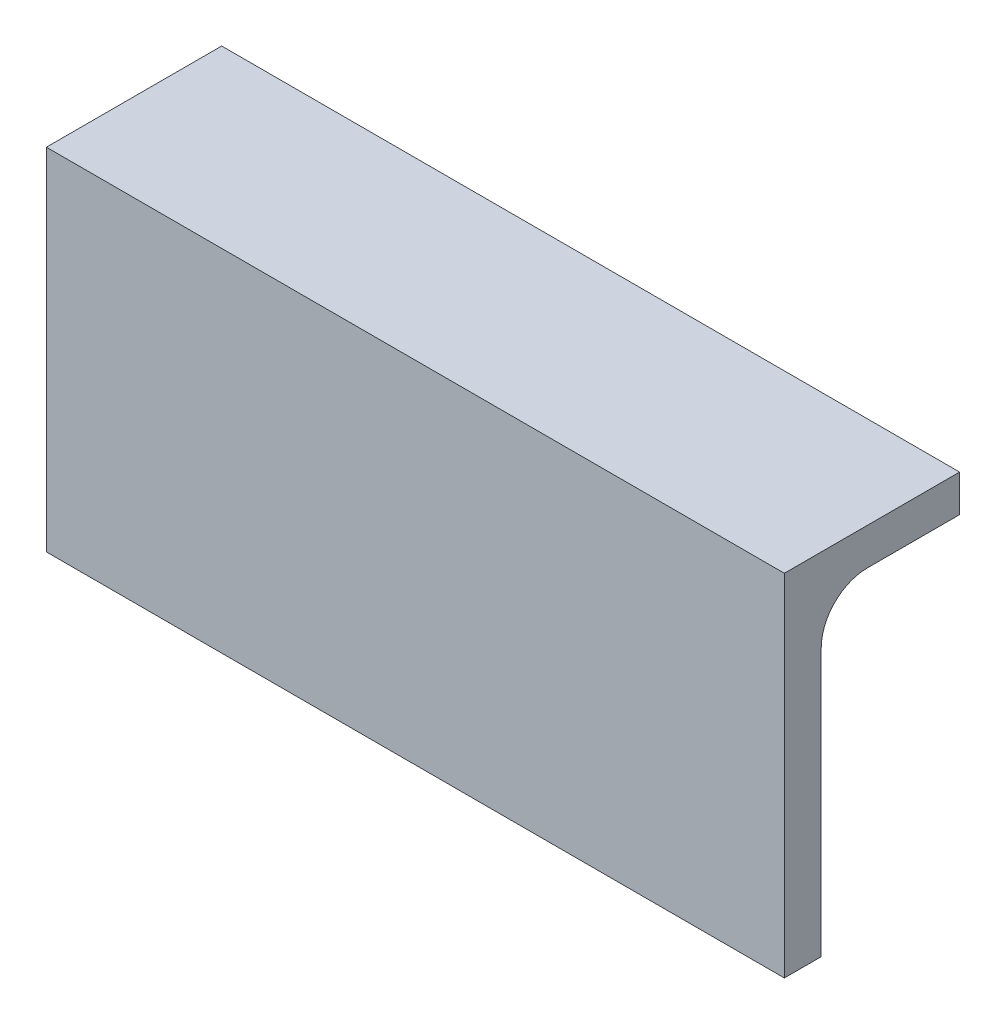
ISO-10303-21;
HEADER;
FILE_DESCRIPTION(('STEP AP214'),'2;1');
FILE_NAME('part.step','',(''),(''),'','','');
FILE_SCHEMA(('AUTOMOTIVE_DESIGN { 1 0 10303 214 1 1 1 1 }'));
ENDSEC;
DATA;
#1=APPLICATION_CONTEXT('core data for automotive mechanical design processes');
#2=APPLICATION_PROTOCOL_DEFINITION('international standard','automotive_design',2000,#1);
#3=PRODUCT_CONTEXT('',#1,'mechanical');
#4=PRODUCT('Part','Part','',(#3));
#5=PRODUCT_RELATED_PRODUCT_CATEGORY('part','',(#4));
#6=PRODUCT_DEFINITION_FORMATION('','',#4);
#7=PRODUCT_DEFINITION_CONTEXT('part definition',#1,'design');
#8=PRODUCT_DEFINITION('design','',#6,#7);
#9=PRODUCT_DEFINITION_SHAPE('','',#8);
#10=(LENGTH_UNIT() NAMED_UNIT(*) SI_UNIT(.MILLI.,.METRE.));
#11=(NAMED_UNIT(*) PLANE_ANGLE_UNIT() SI_UNIT($,.RADIAN.));
#12=(NAMED_UNIT(*) SI_UNIT($,.STERADIAN.) SOLID_ANGLE_UNIT());
#13=UNCERTAINTY_MEASURE_WITH_UNIT(LENGTH_MEASURE(1.E-05),#10,'distance_accuracy_value','');
#14=(GEOMETRIC_REPRESENTATION_CONTEXT(3) GLOBAL_UNCERTAINTY_ASSIGNED_CONTEXT((#13)) GLOBAL_UNIT_ASSIGNED_CONTEXT((#10,
#11,#12)) REPRESENTATION_CONTEXT('',''));
#15=CARTESIAN_POINT('',(0.,0.,0.));
#16=DIRECTION('',(0.,0.,1.));
#17=DIRECTION('',(1.,0.,0.));
#18=AXIS2_PLACEMENT_3D('',#15,#16,#17);
#19=CARTESIAN_POINT('',(0.,0.,1.6));
#20=DIRECTION('',(1.,0.,0.));
#21=DIRECTION('',(0.,1.,0.));
#22=AXIS2_PLACEMENT_3D('',#19,#20,#21);
#23=PLANE('',#22);
#24=DIRECTION('',(0.,0.,1.));
#25=VECTOR('',#24,1.);
#26=CARTESIAN_POINT('',(0.,-0.8,1.6));
#27=LINE('',#26,#25);
#28=CARTESIAN_POINT('',(0.,-0.8,-6.));
#29=VERTEX_POINT('',#28);
#30=CARTESIAN_POINT('',(0.,-0.8,1.6));
#31=VERTEX_POINT('',#30);
#32=EDGE_CURVE('E96',#29,#31,#27,.T.);
#33=ORIENTED_EDGE('',*,*,#32,.F.);
#34=DIRECTION('',(0.,1.,0.));
#35=VECTOR('',#34,1.);
#36=CARTESIAN_POINT('',(0.,0.,-6.));
#37=LINE('',#36,#35);
#38=CARTESIAN_POINT('',(0.,-2.4,-6.));
#39=VERTEX_POINT('',#38);
#40=EDGE_CURVE('E146',#39,#29,#37,.T.);
#41=ORIENTED_EDGE('',*,*,#40,.F.);
#42=DIRECTION('',(0.,0.,1.));
#43=VECTOR('',#42,1.);
#44=CARTESIAN_POINT('',(0.,-2.4,-6.));
#45=LINE('',#44,#43);
#46=CARTESIAN_POINT('',(0.,-2.4,-2.));
#47=VERTEX_POINT('',#46);
#48=EDGE_CURVE('E141',#39,#47,#45,.T.);
#49=ORIENTED_EDGE('',*,*,#48,.T.);
#50=CARTESIAN_POINT('',(0.,-4.4,-2.));
#51=DIRECTION('',(1.,0.,0.));
#52=DIRECTION('',(0.,1.,0.));
#53=AXIS2_PLACEMENT_3D('',#50,#51,#52);
#54=CIRCLE('',#53,2.);
#55=CARTESIAN_POINT('',(0.,-4.4,0.));
#56=VERTEX_POINT('',#55);
#57=EDGE_CURVE('E41',#47,#56,#54,.T.);
#58=ORIENTED_EDGE('',*,*,#57,.T.);
#59=DIRECTION('',(0.,-1.,0.));
#60=VECTOR('',#59,1.);
#61=CARTESIAN_POINT('',(0.,0.,0.));
#62=LINE('',#61,#60);
#63=CARTESIAN_POINT('',(0.,-16.,0.));
#64=VERTEX_POINT('',#63);
#65=EDGE_CURVE('E123',#56,#64,#62,.T.);
#66=ORIENTED_EDGE('',*,*,#65,.T.);
#67=DIRECTION('',(0.,0.,-1.));
#68=VECTOR('',#67,1.);
#69=CARTESIAN_POINT('',(0.,-16.,1.6));
#70=LINE('',#69,#68);
#71=CARTESIAN_POINT('',(0.,-16.,1.6));
#72=VERTEX_POINT('',#71);
#73=EDGE_CURVE('E117',#72,#64,#70,.T.);
#74=ORIENTED_EDGE('',*,*,#73,.F.);
#75=DIRECTION('',(0.,-1.,0.));
#76=VECTOR('',#75,1.);
#77=CARTESIAN_POINT('',(0.,0.,1.6));
#78=LINE('',#77,#76);
#79=EDGE_CURVE('E119',#31,#72,#78,.T.);
#80=ORIENTED_EDGE('',*,*,#79,.F.);
#81=EDGE_LOOP('',(#33,#41,#49,#58,#66,#74,#80));
#82=FACE_BOUND('',#81,.T.);
#83=ADVANCED_FACE('F33',(#82),#23,.F.);
#84=CARTESIAN_POINT('',(32.,0.,1.6));
#85=DIRECTION('',(-1.,0.,0.));
#86=DIRECTION('',(0.,0.,1.));
#87=AXIS2_PLACEMENT_3D('',#84,#85,#86);
#88=PLANE('',#87);
#89=DIRECTION('',(0.,0.,-1.));
#90=VECTOR('',#89,1.);
#91=CARTESIAN_POINT('',(32.,-0.8,1.6));
#92=LINE('',#91,#90);
#93=CARTESIAN_POINT('',(32.,-0.8,1.6));
#94=VERTEX_POINT('',#93);
#95=CARTESIAN_POINT('',(32.,-0.8,-6.));
#96=VERTEX_POINT('',#95);
#97=EDGE_CURVE('E93',#94,#96,#92,.T.);
#98=ORIENTED_EDGE('',*,*,#97,.F.);
#99=DIRECTION('',(0.,1.,0.));
#100=VECTOR('',#99,1.);
#101=CARTESIAN_POINT('',(32.,0.,1.6));
#102=LINE('',#101,#100);
#103=CARTESIAN_POINT('',(32.,-16.,1.6));
#104=VERTEX_POINT('',#103);
#105=EDGE_CURVE('E107',#104,#94,#102,.T.);
#106=ORIENTED_EDGE('',*,*,#105,.F.);
#107=DIRECTION('',(0.,0.,-1.));
#108=VECTOR('',#107,1.);
#109=CARTESIAN_POINT('',(32.,-16.,1.6));
#110=LINE('',#109,#108);
#111=CARTESIAN_POINT('',(32.,-16.,0.));
#112=VERTEX_POINT('',#111);
#113=EDGE_CURVE('E115',#104,#112,#110,.T.);
#114=ORIENTED_EDGE('',*,*,#113,.T.);
#115=DIRECTION('',(0.,1.,0.));
#116=VECTOR('',#115,1.);
#117=CARTESIAN_POINT('',(32.,0.,0.));
#118=LINE('',#117,#116);
#119=CARTESIAN_POINT('',(32.,-4.4,0.));
#120=VERTEX_POINT('',#119);
#121=EDGE_CURVE('E128',#112,#120,#118,.T.);
#122=ORIENTED_EDGE('',*,*,#121,.T.);
#123=CARTESIAN_POINT('',(32.,-4.4,-2.));
#124=DIRECTION('',(-1.,0.,0.));
#125=DIRECTION('',(0.,0.,1.));
#126=AXIS2_PLACEMENT_3D('',#123,#124,#125);
#127=CIRCLE('',#126,2.);
#128=CARTESIAN_POINT('',(32.,-2.4,-2.));
#129=VERTEX_POINT('',#128);
#130=EDGE_CURVE('E11',#120,#129,#127,.T.);
#131=ORIENTED_EDGE('',*,*,#130,.T.);
#132=DIRECTION('',(0.,0.,1.));
#133=VECTOR('',#132,1.);
#134=CARTESIAN_POINT('',(32.,-2.4,-6.));
#135=LINE('',#134,#133);
#136=CARTESIAN_POINT('',(32.,-2.4,-6.));
#137=VERTEX_POINT('',#136);
#138=EDGE_CURVE('E126',#137,#129,#135,.T.);
#139=ORIENTED_EDGE('',*,*,#138,.F.);
#140=DIRECTION('',(0.,-1.,0.));
#141=VECTOR('',#140,1.);
#142=CARTESIAN_POINT('',(32.,0.,-6.));
#143=LINE('',#142,#141);
#144=EDGE_CURVE('E100',#96,#137,#143,.T.);
#145=ORIENTED_EDGE('',*,*,#144,.F.);
#146=EDGE_LOOP('',(#98,#106,#114,#122,#131,#139,#145));
#147=FACE_BOUND('',#146,.T.);
#148=ADVANCED_FACE('F105',(#147),#88,.F.);
#149=CARTESIAN_POINT('',(0.,0.,1.6));
#150=DIRECTION('',(0.,0.,1.));
#151=DIRECTION('',(1.,0.,0.));
#152=AXIS2_PLACEMENT_3D('',#149,#150,#151);
#153=PLANE('',#152);
#154=DIRECTION('',(1.,0.,0.));
#155=VECTOR('',#154,1.);
#156=CARTESIAN_POINT('',(10.,-0.8,1.6));
#157=LINE('',#156,#155);
#158=EDGE_CURVE('E90',#31,#94,#157,.T.);
#159=ORIENTED_EDGE('',*,*,#158,.F.);
#160=ORIENTED_EDGE('',*,*,#79,.T.);
#161=DIRECTION('',(1.,0.,0.));
#162=VECTOR('',#161,1.);
#163=CARTESIAN_POINT('',(0.,-16.,1.6));
#164=LINE('',#163,#162);
#165=EDGE_CURVE('E113',#72,#104,#164,.T.);
#166=ORIENTED_EDGE('',*,*,#165,.T.);
#167=ORIENTED_EDGE('',*,*,#105,.T.);
#168=EDGE_LOOP('',(#159,#160,#166,#167));
#169=FACE_BOUND('',#168,.T.);
#170=ADVANCED_FACE('F111',(#169),#153,.T.);
#171=CARTESIAN_POINT('',(0.,0.,-6.));
#172=DIRECTION('',(0.,0.,-1.));
#173=DIRECTION('',(-1.,0.,0.));
#174=AXIS2_PLACEMENT_3D('',#171,#172,#173);
#175=PLANE('',#174);
#176=ORIENTED_EDGE('',*,*,#40,.T.);
#177=DIRECTION('',(1.,0.,0.));
#178=VECTOR('',#177,1.);
#179=CARTESIAN_POINT('',(0.,-0.8,-6.));
#180=LINE('',#179,#178);
#181=EDGE_CURVE('E109',#29,#96,#180,.T.);
#182=ORIENTED_EDGE('',*,*,#181,.T.);
#183=ORIENTED_EDGE('',*,*,#144,.T.);
#184=DIRECTION('',(-1.,0.,0.));
#185=VECTOR('',#184,1.);
#186=CARTESIAN_POINT('',(32.,-2.4,-6.));
#187=LINE('',#186,#185);
#188=EDGE_CURVE('E149',#137,#39,#187,.T.);
#189=ORIENTED_EDGE('',*,*,#188,.T.);
#190=EDGE_LOOP('',(#176,#182,#183,#189));
#191=FACE_BOUND('',#190,.T.);
#192=ADVANCED_FACE('F172',(#191),#175,.T.);
#193=CARTESIAN_POINT('',(0.,0.,0.));
#194=DIRECTION('',(0.,0.,1.));
#195=DIRECTION('',(1.,0.,0.));
#196=AXIS2_PLACEMENT_3D('',#193,#194,#195);
#197=PLANE('',#196);
#198=ORIENTED_EDGE('',*,*,#65,.F.);
#199=DIRECTION('',(-1.,0.,0.));
#200=VECTOR('',#199,1.);
#201=CARTESIAN_POINT('',(32.,-4.4,0.));
#202=LINE('',#201,#200);
#203=EDGE_CURVE('E54',#56,#120,#202,.F.);
#204=ORIENTED_EDGE('',*,*,#203,.T.);
#205=ORIENTED_EDGE('',*,*,#121,.F.);
#206=DIRECTION('',(1.,0.,0.));
#207=VECTOR('',#206,1.);
#208=CARTESIAN_POINT('',(0.,-16.,0.));
#209=LINE('',#208,#207);
#210=EDGE_CURVE('E125',#64,#112,#209,.T.);
#211=ORIENTED_EDGE('',*,*,#210,.F.);
#212=EDGE_LOOP('',(#198,#204,#205,#211));
#213=FACE_BOUND('',#212,.T.);
#214=ADVANCED_FACE('F156',(#213),#197,.F.);
#215=CARTESIAN_POINT('',(0.,-16.,1.6));
#216=DIRECTION('',(0.,1.,0.));
#217=DIRECTION('',(0.,0.,1.));
#218=AXIS2_PLACEMENT_3D('',#215,#216,#217);
#219=PLANE('',#218);
#220=ORIENTED_EDGE('',*,*,#210,.T.);
#221=ORIENTED_EDGE('',*,*,#113,.F.);
#222=ORIENTED_EDGE('',*,*,#165,.F.);
#223=ORIENTED_EDGE('',*,*,#73,.T.);
#224=EDGE_LOOP('',(#220,#221,#222,#223));
#225=FACE_BOUND('',#224,.T.);
#226=ADVANCED_FACE('F154',(#225),#219,.F.);
#227=CARTESIAN_POINT('',(32.,-2.4,-6.));
#228=DIRECTION('',(0.,1.,0.));
#229=DIRECTION('',(0.,0.,1.));
#230=AXIS2_PLACEMENT_3D('',#227,#228,#229);
#231=PLANE('',#230);
#232=ORIENTED_EDGE('',*,*,#138,.T.);
#233=DIRECTION('',(-1.,0.,0.));
#234=VECTOR('',#233,1.);
#235=CARTESIAN_POINT('',(0.,-2.4,-2.));
#236=LINE('',#235,#234);
#237=EDGE_CURVE('E132',#129,#47,#236,.T.);
#238=ORIENTED_EDGE('',*,*,#237,.T.);
#239=ORIENTED_EDGE('',*,*,#48,.F.);
#240=ORIENTED_EDGE('',*,*,#188,.F.);
#241=EDGE_LOOP('',(#232,#238,#239,#240));
#242=FACE_BOUND('',#241,.T.);
#243=ADVANCED_FACE('F139',(#242),#231,.F.);
#244=CARTESIAN_POINT('',(0.,-0.8,0.));
#245=DIRECTION('',(0.,1.,0.));
#246=DIRECTION('',(0.,0.,1.));
#247=AXIS2_PLACEMENT_3D('',#244,#245,#246);
#248=PLANE('',#247);
#249=ORIENTED_EDGE('',*,*,#97,.T.);
#250=ORIENTED_EDGE('',*,*,#181,.F.);
#251=ORIENTED_EDGE('',*,*,#32,.T.);
#252=ORIENTED_EDGE('',*,*,#158,.T.);
#253=EDGE_LOOP('',(#249,#250,#251,#252));
#254=FACE_BOUND('',#253,.T.);
#255=ADVANCED_FACE('F92',(#254),#248,.T.);
#256=CARTESIAN_POINT('',(32.,-4.4,-2.));
#257=DIRECTION('',(1.,0.,0.));
#258=DIRECTION('',(0.,0.,-1.));
#259=AXIS2_PLACEMENT_3D('',#256,#257,#258);
#260=CYLINDRICAL_SURFACE('',#259,2.);
#261=ORIENTED_EDGE('',*,*,#130,.F.);
#262=ORIENTED_EDGE('',*,*,#203,.F.);
#263=ORIENTED_EDGE('',*,*,#57,.F.);
#264=ORIENTED_EDGE('',*,*,#237,.F.);
#265=EDGE_LOOP('',(#261,#262,#263,#264));
#266=FACE_BOUND('',#265,.T.);
#267=ADVANCED_FACE('F35',(#266),#260,.F.);
#268=CLOSED_SHELL('',(#83,#148,#170,#192,#214,#226,#243,#255,#267));
#269=MANIFOLD_SOLID_BREP('B2',#268);
#270=ADVANCED_BREP_SHAPE_REPRESENTATION('',(#18,#269),#14);
#271=SHAPE_DEFINITION_REPRESENTATION(#9,#270);
ENDSEC;
END-ISO-10303-21;
